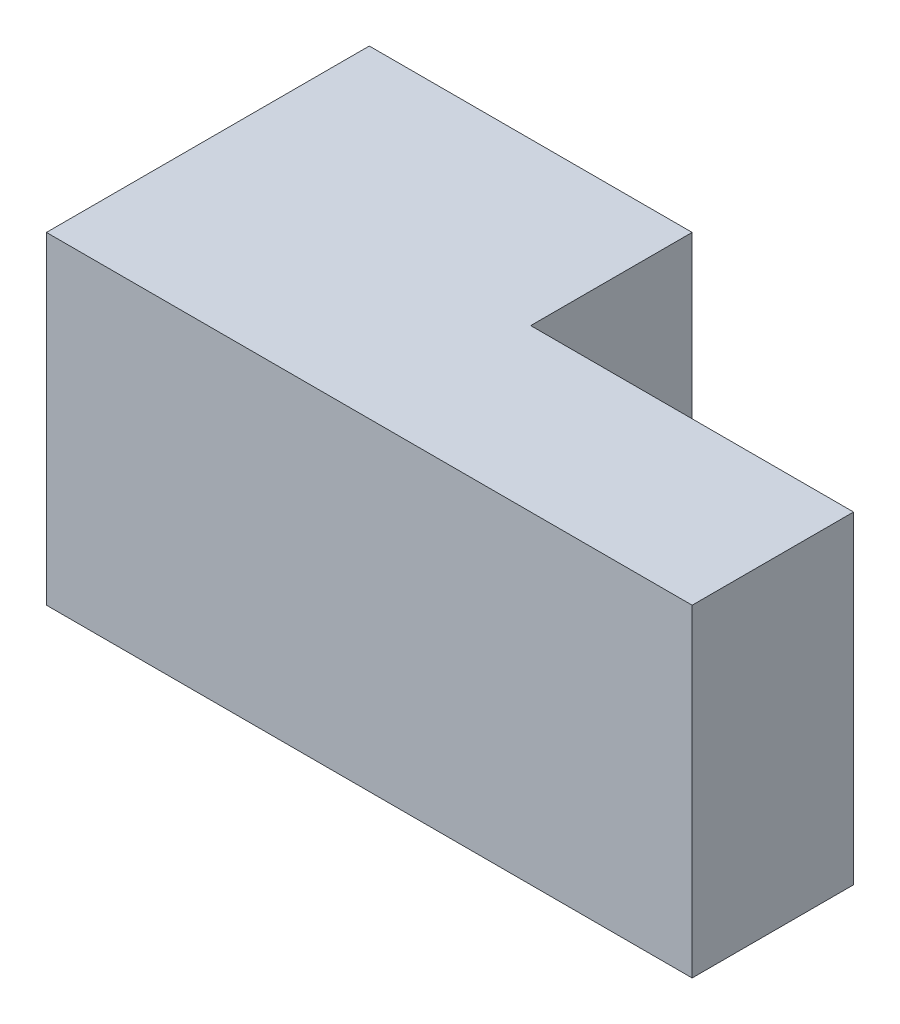
ISO-10303-21;
HEADER;
FILE_DESCRIPTION(('STEP AP214'),'2;1');
FILE_NAME('part.step','',(''),(''),'','','');
FILE_SCHEMA(('AUTOMOTIVE_DESIGN { 1 0 10303 214 1 1 1 1 }'));
ENDSEC;
DATA;
#1=APPLICATION_CONTEXT('core data for automotive mechanical design processes');
#2=APPLICATION_PROTOCOL_DEFINITION('international standard','automotive_design',2000,#1);
#3=PRODUCT_CONTEXT('',#1,'mechanical');
#4=PRODUCT('Part','Part','',(#3));
#5=PRODUCT_RELATED_PRODUCT_CATEGORY('part','',(#4));
#6=PRODUCT_DEFINITION_FORMATION('','',#4);
#7=PRODUCT_DEFINITION_CONTEXT('part definition',#1,'design');
#8=PRODUCT_DEFINITION('design','',#6,#7);
#9=PRODUCT_DEFINITION_SHAPE('','',#8);
#10=(LENGTH_UNIT() NAMED_UNIT(*) SI_UNIT(.MILLI.,.METRE.));
#11=(NAMED_UNIT(*) PLANE_ANGLE_UNIT() SI_UNIT($,.RADIAN.));
#12=(NAMED_UNIT(*) SI_UNIT($,.STERADIAN.) SOLID_ANGLE_UNIT());
#13=UNCERTAINTY_MEASURE_WITH_UNIT(LENGTH_MEASURE(1.E-05),#10,'distance_accuracy_value','');
#14=(GEOMETRIC_REPRESENTATION_CONTEXT(3) GLOBAL_UNCERTAINTY_ASSIGNED_CONTEXT((#13)) GLOBAL_UNIT_ASSIGNED_CONTEXT((#10,
#11,#12)) REPRESENTATION_CONTEXT('',''));
#15=CARTESIAN_POINT('',(0.,0.,0.));
#16=DIRECTION('',(0.,0.,1.));
#17=DIRECTION('',(1.,0.,0.));
#18=AXIS2_PLACEMENT_3D('',#15,#16,#17);
#19=CARTESIAN_POINT('',(12.7,0.,12.7));
#20=DIRECTION('',(-1.,0.,0.));
#21=DIRECTION('',(0.,0.,1.));
#22=AXIS2_PLACEMENT_3D('',#19,#20,#21);
#23=PLANE('',#22);
#24=DIRECTION('',(0.,1.,0.));
#25=VECTOR('',#24,1.);
#26=CARTESIAN_POINT('',(12.7,12.7,6.35));
#27=LINE('',#26,#25);
#28=CARTESIAN_POINT('',(12.7,0.,6.35));
#29=VERTEX_POINT('',#28);
#30=CARTESIAN_POINT('',(12.7,12.7,6.35));
#31=VERTEX_POINT('',#30);
#32=EDGE_CURVE('E47',#29,#31,#27,.T.);
#33=ORIENTED_EDGE('',*,*,#32,.F.);
#34=DIRECTION('',(0.,0.,-1.));
#35=VECTOR('',#34,1.);
#36=CARTESIAN_POINT('',(12.7,0.,12.7));
#37=LINE('',#36,#35);
#38=CARTESIAN_POINT('',(12.7,0.,0.));
#39=VERTEX_POINT('',#38);
#40=EDGE_CURVE('E40',#29,#39,#37,.T.);
#41=ORIENTED_EDGE('',*,*,#40,.T.);
#42=DIRECTION('',(0.,1.,0.));
#43=VECTOR('',#42,1.);
#44=CARTESIAN_POINT('',(12.7,0.,0.));
#45=LINE('',#44,#43);
#46=CARTESIAN_POINT('',(12.7,12.7,0.));
#47=VERTEX_POINT('',#46);
#48=EDGE_CURVE('E86',#39,#47,#45,.T.);
#49=ORIENTED_EDGE('',*,*,#48,.T.);
#50=DIRECTION('',(0.,0.,-1.));
#51=VECTOR('',#50,1.);
#52=CARTESIAN_POINT('',(12.7,12.7,12.7));
#53=LINE('',#52,#51);
#54=EDGE_CURVE('E80',#31,#47,#53,.T.);
#55=ORIENTED_EDGE('',*,*,#54,.F.);
#56=EDGE_LOOP('',(#33,#41,#49,#55));
#57=FACE_BOUND('',#56,.T.);
#58=ADVANCED_FACE('F32',(#57),#23,.F.);
#59=CARTESIAN_POINT('',(0.,0.,12.7));
#60=DIRECTION('',(1.,0.,0.));
#61=DIRECTION('',(0.,0.,-1.));
#62=AXIS2_PLACEMENT_3D('',#59,#60,#61);
#63=PLANE('',#62);
#64=DIRECTION('',(0.,-1.,0.));
#65=VECTOR('',#64,1.);
#66=CARTESIAN_POINT('',(0.,0.,0.));
#67=LINE('',#66,#65);
#68=CARTESIAN_POINT('',(0.,12.7,0.));
#69=VERTEX_POINT('',#68);
#70=CARTESIAN_POINT('',(0.,0.,0.));
#71=VERTEX_POINT('',#70);
#72=EDGE_CURVE('E91',#69,#71,#67,.T.);
#73=ORIENTED_EDGE('',*,*,#72,.T.);
#74=DIRECTION('',(0.,0.,-1.));
#75=VECTOR('',#74,1.);
#76=CARTESIAN_POINT('',(0.,0.,12.7));
#77=LINE('',#76,#75);
#78=CARTESIAN_POINT('',(0.,0.,12.7));
#79=VERTEX_POINT('',#78);
#80=EDGE_CURVE('E11',#79,#71,#77,.T.);
#81=ORIENTED_EDGE('',*,*,#80,.F.);
#82=DIRECTION('',(0.,-1.,0.));
#83=VECTOR('',#82,1.);
#84=CARTESIAN_POINT('',(0.,0.,12.7));
#85=LINE('',#84,#83);
#86=CARTESIAN_POINT('',(0.,12.7,12.7));
#87=VERTEX_POINT('',#86);
#88=EDGE_CURVE('E85',#87,#79,#85,.T.);
#89=ORIENTED_EDGE('',*,*,#88,.F.);
#90=DIRECTION('',(0.,0.,-1.));
#91=VECTOR('',#90,1.);
#92=CARTESIAN_POINT('',(0.,12.7,12.7));
#93=LINE('',#92,#91);
#94=EDGE_CURVE('E77',#87,#69,#93,.T.);
#95=ORIENTED_EDGE('',*,*,#94,.T.);
#96=EDGE_LOOP('',(#73,#81,#89,#95));
#97=FACE_BOUND('',#96,.T.);
#98=ADVANCED_FACE('F34',(#97),#63,.F.);
#99=CARTESIAN_POINT('',(0.,0.,12.7));
#100=DIRECTION('',(0.,1.,0.));
#101=DIRECTION('',(0.,0.,1.));
#102=AXIS2_PLACEMENT_3D('',#99,#100,#101);
#103=PLANE('',#102);
#104=DIRECTION('',(1.,0.,0.));
#105=VECTOR('',#104,1.);
#106=CARTESIAN_POINT('',(0.,0.,0.));
#107=LINE('',#106,#105);
#108=EDGE_CURVE('E95',#71,#39,#107,.T.);
#109=ORIENTED_EDGE('',*,*,#108,.T.);
#110=ORIENTED_EDGE('',*,*,#40,.F.);
#111=DIRECTION('',(-1.,0.,0.));
#112=VECTOR('',#111,1.);
#113=CARTESIAN_POINT('',(25.4,0.,6.35));
#114=LINE('',#113,#112);
#115=CARTESIAN_POINT('',(25.4,0.,6.35));
#116=VERTEX_POINT('',#115);
#117=EDGE_CURVE('E96',#116,#29,#114,.T.);
#118=ORIENTED_EDGE('',*,*,#117,.F.);
#119=DIRECTION('',(0.,0.,-1.));
#120=VECTOR('',#119,1.);
#121=CARTESIAN_POINT('',(25.4,0.,12.7));
#122=LINE('',#121,#120);
#123=CARTESIAN_POINT('',(25.4,0.,12.7));
#124=VERTEX_POINT('',#123);
#125=EDGE_CURVE('E114',#124,#116,#122,.T.);
#126=ORIENTED_EDGE('',*,*,#125,.F.);
#127=DIRECTION('',(1.,0.,0.));
#128=VECTOR('',#127,1.);
#129=CARTESIAN_POINT('',(0.,0.,12.7));
#130=LINE('',#129,#128);
#131=EDGE_CURVE('E111',#79,#124,#130,.T.);
#132=ORIENTED_EDGE('',*,*,#131,.F.);
#133=ORIENTED_EDGE('',*,*,#80,.T.);
#134=EDGE_LOOP('',(#109,#110,#118,#126,#132,#133));
#135=FACE_BOUND('',#134,.T.);
#136=ADVANCED_FACE('F108',(#135),#103,.F.);
#137=CARTESIAN_POINT('',(0.,12.7,12.7));
#138=DIRECTION('',(0.,-1.,0.));
#139=DIRECTION('',(0.,0.,-1.));
#140=AXIS2_PLACEMENT_3D('',#137,#138,#139);
#141=PLANE('',#140);
#142=DIRECTION('',(-1.,0.,0.));
#143=VECTOR('',#142,1.);
#144=CARTESIAN_POINT('',(0.,12.7,0.));
#145=LINE('',#144,#143);
#146=EDGE_CURVE('E74',#47,#69,#145,.T.);
#147=ORIENTED_EDGE('',*,*,#146,.T.);
#148=ORIENTED_EDGE('',*,*,#94,.F.);
#149=DIRECTION('',(-1.,0.,0.));
#150=VECTOR('',#149,1.);
#151=CARTESIAN_POINT('',(0.,12.7,12.7));
#152=LINE('',#151,#150);
#153=CARTESIAN_POINT('',(25.4,12.7,12.7));
#154=VERTEX_POINT('',#153);
#155=EDGE_CURVE('E56',#154,#87,#152,.T.);
#156=ORIENTED_EDGE('',*,*,#155,.F.);
#157=DIRECTION('',(0.,0.,1.));
#158=VECTOR('',#157,1.);
#159=CARTESIAN_POINT('',(25.4,12.7,12.7));
#160=LINE('',#159,#158);
#161=CARTESIAN_POINT('',(25.4,12.7,6.35));
#162=VERTEX_POINT('',#161);
#163=EDGE_CURVE('E120',#162,#154,#160,.T.);
#164=ORIENTED_EDGE('',*,*,#163,.F.);
#165=DIRECTION('',(-1.,0.,0.));
#166=VECTOR('',#165,1.);
#167=CARTESIAN_POINT('',(25.4,12.7,6.35));
#168=LINE('',#167,#166);
#169=EDGE_CURVE('E100',#162,#31,#168,.T.);
#170=ORIENTED_EDGE('',*,*,#169,.T.);
#171=ORIENTED_EDGE('',*,*,#54,.T.);
#172=EDGE_LOOP('',(#147,#148,#156,#164,#170,#171));
#173=FACE_BOUND('',#172,.T.);
#174=ADVANCED_FACE('F76',(#173),#141,.F.);
#175=CARTESIAN_POINT('',(0.,0.,12.7));
#176=DIRECTION('',(0.,0.,-1.));
#177=DIRECTION('',(-1.,0.,0.));
#178=AXIS2_PLACEMENT_3D('',#175,#176,#177);
#179=PLANE('',#178);
#180=ORIENTED_EDGE('',*,*,#88,.T.);
#181=ORIENTED_EDGE('',*,*,#131,.T.);
#182=DIRECTION('',(0.,-1.,0.));
#183=VECTOR('',#182,1.);
#184=CARTESIAN_POINT('',(25.4,12.7,12.7));
#185=LINE('',#184,#183);
#186=EDGE_CURVE('E122',#154,#124,#185,.T.);
#187=ORIENTED_EDGE('',*,*,#186,.F.);
#188=ORIENTED_EDGE('',*,*,#155,.T.);
#189=EDGE_LOOP('',(#180,#181,#187,#188));
#190=FACE_BOUND('',#189,.T.);
#191=ADVANCED_FACE('F116',(#190),#179,.F.);
#192=CARTESIAN_POINT('',(0.,0.,0.));
#193=DIRECTION('',(0.,0.,-1.));
#194=DIRECTION('',(-1.,0.,0.));
#195=AXIS2_PLACEMENT_3D('',#192,#193,#194);
#196=PLANE('',#195);
#197=ORIENTED_EDGE('',*,*,#72,.F.);
#198=ORIENTED_EDGE('',*,*,#146,.F.);
#199=ORIENTED_EDGE('',*,*,#48,.F.);
#200=ORIENTED_EDGE('',*,*,#108,.F.);
#201=EDGE_LOOP('',(#197,#198,#199,#200));
#202=FACE_BOUND('',#201,.T.);
#203=ADVANCED_FACE('F93',(#202),#196,.T.);
#204=CARTESIAN_POINT('',(25.4,12.7,6.35));
#205=DIRECTION('',(0.,0.,1.));
#206=DIRECTION('',(0.,-1.,0.));
#207=AXIS2_PLACEMENT_3D('',#204,#205,#206);
#208=PLANE('',#207);
#209=ORIENTED_EDGE('',*,*,#32,.T.);
#210=ORIENTED_EDGE('',*,*,#169,.F.);
#211=DIRECTION('',(0.,1.,0.));
#212=VECTOR('',#211,1.);
#213=CARTESIAN_POINT('',(25.4,12.7,6.35));
#214=LINE('',#213,#212);
#215=EDGE_CURVE('E125',#116,#162,#214,.T.);
#216=ORIENTED_EDGE('',*,*,#215,.F.);
#217=ORIENTED_EDGE('',*,*,#117,.T.);
#218=EDGE_LOOP('',(#209,#210,#216,#217));
#219=FACE_BOUND('',#218,.T.);
#220=ADVANCED_FACE('F141',(#219),#208,.F.);
#221=CARTESIAN_POINT('',(25.4,0.,0.));
#222=DIRECTION('',(1.,0.,0.));
#223=DIRECTION('',(0.,0.,-1.));
#224=AXIS2_PLACEMENT_3D('',#221,#222,#223);
#225=PLANE('',#224);
#226=ORIENTED_EDGE('',*,*,#186,.T.);
#227=ORIENTED_EDGE('',*,*,#125,.T.);
#228=ORIENTED_EDGE('',*,*,#215,.T.);
#229=ORIENTED_EDGE('',*,*,#163,.T.);
#230=EDGE_LOOP('',(#226,#227,#228,#229));
#231=FACE_BOUND('',#230,.T.);
#232=ADVANCED_FACE('F130',(#231),#225,.T.);
#233=CLOSED_SHELL('',(#58,#98,#136,#174,#191,#203,#220,#232));
#234=MANIFOLD_SOLID_BREP('B2',#233);
#235=ADVANCED_BREP_SHAPE_REPRESENTATION('',(#18,#234),#14);
#236=SHAPE_DEFINITION_REPRESENTATION(#9,#235);
ENDSEC;
END-ISO-10303-21;
